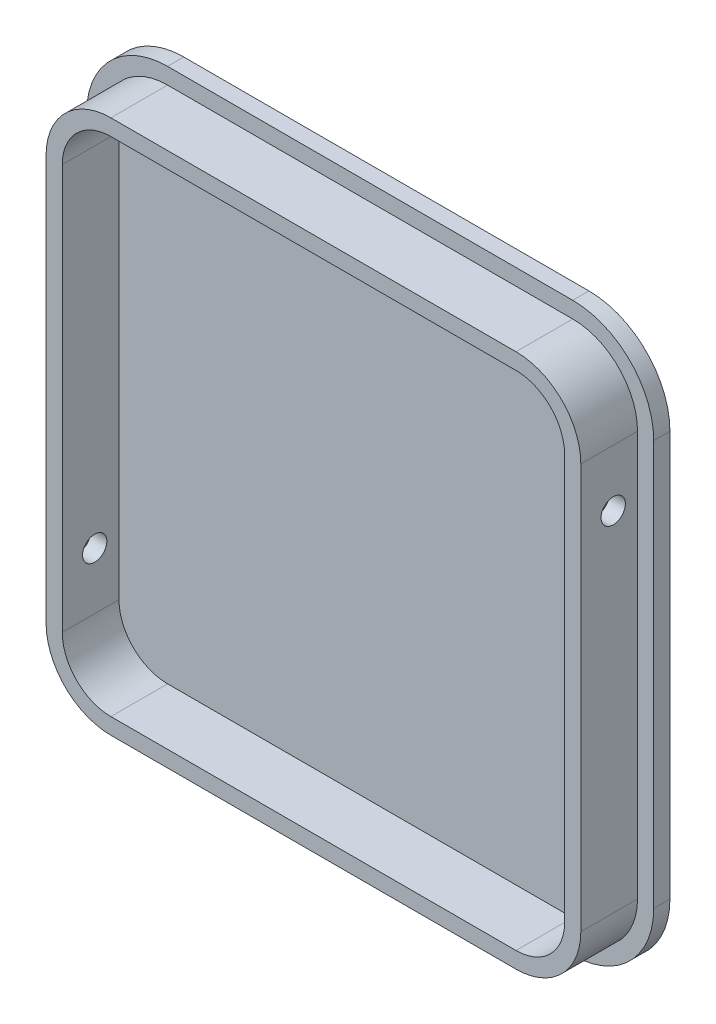
ISO-10303-21;
HEADER;
FILE_DESCRIPTION(('STEP AP214'),'2;1');
FILE_NAME('part.step','',(''),(''),'','','');
FILE_SCHEMA(('AUTOMOTIVE_DESIGN { 1 0 10303 214 1 1 1 1 }'));
ENDSEC;
DATA;
#1=APPLICATION_CONTEXT('core data for automotive mechanical design processes');
#2=APPLICATION_PROTOCOL_DEFINITION('international standard','automotive_design',2000,#1);
#3=PRODUCT_CONTEXT('',#1,'mechanical');
#4=PRODUCT('Part','Part','',(#3));
#5=PRODUCT_RELATED_PRODUCT_CATEGORY('part','',(#4));
#6=PRODUCT_DEFINITION_FORMATION('','',#4);
#7=PRODUCT_DEFINITION_CONTEXT('part definition',#1,'design');
#8=PRODUCT_DEFINITION('design','',#6,#7);
#9=PRODUCT_DEFINITION_SHAPE('','',#8);
#10=(LENGTH_UNIT() NAMED_UNIT(*) SI_UNIT(.MILLI.,.METRE.));
#11=(NAMED_UNIT(*) PLANE_ANGLE_UNIT() SI_UNIT($,.RADIAN.));
#12=(NAMED_UNIT(*) SI_UNIT($,.STERADIAN.) SOLID_ANGLE_UNIT());
#13=UNCERTAINTY_MEASURE_WITH_UNIT(LENGTH_MEASURE(1.E-05),#10,'distance_accuracy_value','');
#14=(GEOMETRIC_REPRESENTATION_CONTEXT(3) GLOBAL_UNCERTAINTY_ASSIGNED_CONTEXT((#13)) GLOBAL_UNIT_ASSIGNED_CONTEXT((#10,
#11,#12)) REPRESENTATION_CONTEXT('',''));
#15=CARTESIAN_POINT('',(0.,0.,0.));
#16=DIRECTION('',(0.,0.,1.));
#17=DIRECTION('',(1.,0.,0.));
#18=AXIS2_PLACEMENT_3D('',#15,#16,#17);
#19=CARTESIAN_POINT('',(-23.1085058967154,12.9180091675496,9.));
#20=DIRECTION('',(0.,0.,-1.));
#21=DIRECTION('',(-1.,0.,0.));
#22=AXIS2_PLACEMENT_3D('',#19,#20,#21);
#23=PLANE('',#22);
#24=CARTESIAN_POINT('',(-23.1085058967154,12.9180091675496,9.));
#25=DIRECTION('',(0.,0.,1.));
#26=DIRECTION('',(-1.,0.,0.));
#27=AXIS2_PLACEMENT_3D('',#24,#25,#26);
#28=CIRCLE('',#27,8.);
#29=CARTESIAN_POINT('',(-23.1085058967153,20.9180091675496,9.));
#30=VERTEX_POINT('',#29);
#31=CARTESIAN_POINT('',(-31.1085058967154,12.9180091675496,9.));
#32=VERTEX_POINT('',#31);
#33=EDGE_CURVE('E280',#30,#32,#28,.T.);
#34=ORIENTED_EDGE('',*,*,#33,.T.);
#35=DIRECTION('',(0.,-1.,0.));
#36=VECTOR('',#35,1.);
#37=CARTESIAN_POINT('',(-31.1085058967154,12.9180091675496,9.));
#38=LINE('',#37,#36);
#39=CARTESIAN_POINT('',(-31.1085058967154,-37.0819908324503,9.));
#40=VERTEX_POINT('',#39);
#41=EDGE_CURVE('E284',#32,#40,#38,.T.);
#42=ORIENTED_EDGE('',*,*,#41,.T.);
#43=CARTESIAN_POINT('',(-23.1085058967154,-37.0819908324504,9.));
#44=DIRECTION('',(0.,0.,1.));
#45=DIRECTION('',(-1.,0.,0.));
#46=AXIS2_PLACEMENT_3D('',#43,#44,#45);
#47=CIRCLE('',#46,8.);
#48=CARTESIAN_POINT('',(-23.1085058967153,-45.0819908324504,9.));
#49=VERTEX_POINT('',#48);
#50=EDGE_CURVE('E288',#40,#49,#47,.T.);
#51=ORIENTED_EDGE('',*,*,#50,.T.);
#52=DIRECTION('',(1.,0.,0.));
#53=VECTOR('',#52,1.);
#54=CARTESIAN_POINT('',(-23.1085058967153,-45.0819908324504,9.));
#55=LINE('',#54,#53);
#56=CARTESIAN_POINT('',(26.8914941032846,-45.0819908324504,9.));
#57=VERTEX_POINT('',#56);
#58=EDGE_CURVE('E291',#49,#57,#55,.T.);
#59=ORIENTED_EDGE('',*,*,#58,.T.);
#60=CARTESIAN_POINT('',(26.8914941032847,-37.0819908324504,9.));
#61=DIRECTION('',(0.,0.,1.));
#62=DIRECTION('',(1.,0.,0.));
#63=AXIS2_PLACEMENT_3D('',#60,#61,#62);
#64=CIRCLE('',#63,8.);
#65=CARTESIAN_POINT('',(34.8914941032847,-37.0819908324504,9.));
#66=VERTEX_POINT('',#65);
#67=EDGE_CURVE('E294',#57,#66,#64,.T.);
#68=ORIENTED_EDGE('',*,*,#67,.T.);
#69=DIRECTION('',(0.,1.,0.));
#70=VECTOR('',#69,1.);
#71=CARTESIAN_POINT('',(34.8914941032846,12.9180091675496,9.));
#72=LINE('',#71,#70);
#73=CARTESIAN_POINT('',(34.8914941032846,12.9180091675496,9.));
#74=VERTEX_POINT('',#73);
#75=EDGE_CURVE('E297',#66,#74,#72,.T.);
#76=ORIENTED_EDGE('',*,*,#75,.T.);
#77=CARTESIAN_POINT('',(26.8914941032846,12.9180091675496,9.));
#78=DIRECTION('',(0.,0.,1.));
#79=DIRECTION('',(1.,0.,0.));
#80=AXIS2_PLACEMENT_3D('',#77,#78,#79);
#81=CIRCLE('',#80,8.);
#82=CARTESIAN_POINT('',(26.8914941032846,20.9180091675496,9.));
#83=VERTEX_POINT('',#82);
#84=EDGE_CURVE('E300',#74,#83,#81,.T.);
#85=ORIENTED_EDGE('',*,*,#84,.T.);
#86=DIRECTION('',(-1.,0.,0.));
#87=VECTOR('',#86,1.);
#88=CARTESIAN_POINT('',(-23.1085058967153,20.9180091675496,9.));
#89=LINE('',#88,#87);
#90=EDGE_CURVE('E303',#83,#30,#89,.T.);
#91=ORIENTED_EDGE('',*,*,#90,.T.);
#92=EDGE_LOOP('',(#34,#42,#51,#59,#68,#76,#85,#91));
#93=FACE_BOUND('',#92,.T.);
#94=CARTESIAN_POINT('',(-23.1085058967154,12.9180091675496,9.));
#95=DIRECTION('',(0.,0.,-1.));
#96=DIRECTION('',(-1.,0.,0.));
#97=AXIS2_PLACEMENT_3D('',#94,#95,#96);
#98=CIRCLE('',#97,6.);
#99=CARTESIAN_POINT('',(-23.1085058967153,18.9180091675496,9.));
#100=VERTEX_POINT('',#99);
#101=CARTESIAN_POINT('',(-29.1085058967154,12.9180091675496,9.));
#102=VERTEX_POINT('',#101);
#103=EDGE_CURVE('E204',#100,#102,#98,.F.);
#104=ORIENTED_EDGE('',*,*,#103,.F.);
#105=DIRECTION('',(-1.,0.,0.));
#106=VECTOR('',#105,1.);
#107=CARTESIAN_POINT('',(-23.1085058967154,18.9180091675496,9.));
#108=LINE('',#107,#106);
#109=CARTESIAN_POINT('',(26.8914941032846,18.9180091675496,9.));
#110=VERTEX_POINT('',#109);
#111=EDGE_CURVE('E250',#110,#100,#108,.T.);
#112=ORIENTED_EDGE('',*,*,#111,.F.);
#113=CARTESIAN_POINT('',(26.8914941032846,12.9180091675496,9.));
#114=DIRECTION('',(0.,0.,-1.));
#115=DIRECTION('',(-1.,0.,0.));
#116=AXIS2_PLACEMENT_3D('',#113,#114,#115);
#117=CIRCLE('',#116,6.);
#118=CARTESIAN_POINT('',(32.8914941032846,12.9180091675496,9.));
#119=VERTEX_POINT('',#118);
#120=EDGE_CURVE('E247',#119,#110,#117,.F.);
#121=ORIENTED_EDGE('',*,*,#120,.F.);
#122=DIRECTION('',(0.,1.,0.));
#123=VECTOR('',#122,1.);
#124=CARTESIAN_POINT('',(32.8914941032846,12.9180091675497,9.));
#125=LINE('',#124,#123);
#126=CARTESIAN_POINT('',(32.8914941032847,-37.0819908324504,9.));
#127=VERTEX_POINT('',#126);
#128=EDGE_CURVE('E244',#127,#119,#125,.T.);
#129=ORIENTED_EDGE('',*,*,#128,.F.);
#130=CARTESIAN_POINT('',(26.8914941032847,-37.0819908324504,9.));
#131=DIRECTION('',(0.,0.,-1.));
#132=DIRECTION('',(-1.,0.,0.));
#133=AXIS2_PLACEMENT_3D('',#130,#131,#132);
#134=CIRCLE('',#133,6.);
#135=CARTESIAN_POINT('',(26.8914941032846,-43.0819908324504,9.));
#136=VERTEX_POINT('',#135);
#137=EDGE_CURVE('E241',#136,#127,#134,.F.);
#138=ORIENTED_EDGE('',*,*,#137,.F.);
#139=DIRECTION('',(1.,0.,0.));
#140=VECTOR('',#139,1.);
#141=CARTESIAN_POINT('',(-23.1085058967154,-43.0819908324504,9.));
#142=LINE('',#141,#140);
#143=CARTESIAN_POINT('',(-23.1085058967153,-43.0819908324504,9.));
#144=VERTEX_POINT('',#143);
#145=EDGE_CURVE('E235',#144,#136,#142,.T.);
#146=ORIENTED_EDGE('',*,*,#145,.F.);
#147=CARTESIAN_POINT('',(-23.1085058967154,-37.0819908324504,9.));
#148=DIRECTION('',(0.,0.,-1.));
#149=DIRECTION('',(-1.,0.,0.));
#150=AXIS2_PLACEMENT_3D('',#147,#148,#149);
#151=CIRCLE('',#150,6.);
#152=CARTESIAN_POINT('',(-29.1085058967153,-37.0819908324503,9.));
#153=VERTEX_POINT('',#152);
#154=EDGE_CURVE('E231',#153,#144,#151,.F.);
#155=ORIENTED_EDGE('',*,*,#154,.F.);
#156=DIRECTION('',(0.,-1.,0.));
#157=VECTOR('',#156,1.);
#158=CARTESIAN_POINT('',(-29.1085058967154,12.9180091675496,9.));
#159=LINE('',#158,#157);
#160=EDGE_CURVE('E215',#102,#153,#159,.T.);
#161=ORIENTED_EDGE('',*,*,#160,.F.);
#162=EDGE_LOOP('',(#104,#112,#121,#129,#138,#146,#155,#161));
#163=FACE_BOUND('',#162,.T.);
#164=ADVANCED_FACE('F39',(#93,#163),#23,.F.);
#165=CARTESIAN_POINT('',(-23.1085058967154,12.9180091675496,2.));
#166=DIRECTION('',(0.,0.,-1.));
#167=DIRECTION('',(-1.,0.,0.));
#168=AXIS2_PLACEMENT_3D('',#165,#166,#167);
#169=PLANE('',#168);
#170=CARTESIAN_POINT('',(-23.1085058967154,12.9180091675496,2.));
#171=DIRECTION('',(0.,0.,1.));
#172=DIRECTION('',(-1.,0.,0.));
#173=AXIS2_PLACEMENT_3D('',#170,#171,#172);
#174=CIRCLE('',#173,10.);
#175=CARTESIAN_POINT('',(-23.1085058967154,22.9180091675496,2.));
#176=VERTEX_POINT('',#175);
#177=CARTESIAN_POINT('',(-33.1085058967154,12.9180091675496,2.));
#178=VERTEX_POINT('',#177);
#179=EDGE_CURVE('E367',#176,#178,#174,.T.);
#180=ORIENTED_EDGE('',*,*,#179,.T.);
#181=DIRECTION('',(0.,-1.,0.));
#182=VECTOR('',#181,1.);
#183=CARTESIAN_POINT('',(-33.1085058967154,12.9180091675496,2.));
#184=LINE('',#183,#182);
#185=CARTESIAN_POINT('',(-33.1085058967154,-37.0819908324504,2.));
#186=VERTEX_POINT('',#185);
#187=EDGE_CURVE('E371',#178,#186,#184,.T.);
#188=ORIENTED_EDGE('',*,*,#187,.T.);
#189=CARTESIAN_POINT('',(-23.1085058967154,-37.0819908324504,2.));
#190=DIRECTION('',(0.,0.,1.));
#191=DIRECTION('',(-1.,0.,0.));
#192=AXIS2_PLACEMENT_3D('',#189,#190,#191);
#193=CIRCLE('',#192,10.);
#194=CARTESIAN_POINT('',(-23.1085058967153,-47.0819908324504,2.));
#195=VERTEX_POINT('',#194);
#196=EDGE_CURVE('E375',#186,#195,#193,.T.);
#197=ORIENTED_EDGE('',*,*,#196,.T.);
#198=DIRECTION('',(1.,0.,0.));
#199=VECTOR('',#198,1.);
#200=CARTESIAN_POINT('',(-23.1085058967154,-47.0819908324504,2.));
#201=LINE('',#200,#199);
#202=CARTESIAN_POINT('',(26.8914941032846,-47.0819908324504,2.));
#203=VERTEX_POINT('',#202);
#204=EDGE_CURVE('E378',#195,#203,#201,.T.);
#205=ORIENTED_EDGE('',*,*,#204,.T.);
#206=CARTESIAN_POINT('',(26.8914941032846,-37.0819908324504,2.));
#207=DIRECTION('',(0.,0.,1.));
#208=DIRECTION('',(1.,0.,0.));
#209=AXIS2_PLACEMENT_3D('',#206,#207,#208);
#210=CIRCLE('',#209,10.);
#211=CARTESIAN_POINT('',(36.8914941032847,-37.0819908324504,2.));
#212=VERTEX_POINT('',#211);
#213=EDGE_CURVE('E381',#203,#212,#210,.T.);
#214=ORIENTED_EDGE('',*,*,#213,.T.);
#215=DIRECTION('',(0.,1.,0.));
#216=VECTOR('',#215,1.);
#217=CARTESIAN_POINT('',(36.8914941032847,12.9180091675496,2.));
#218=LINE('',#217,#216);
#219=CARTESIAN_POINT('',(36.8914941032847,12.9180091675496,2.));
#220=VERTEX_POINT('',#219);
#221=EDGE_CURVE('E384',#212,#220,#218,.T.);
#222=ORIENTED_EDGE('',*,*,#221,.T.);
#223=CARTESIAN_POINT('',(26.8914941032847,12.9180091675496,2.));
#224=DIRECTION('',(0.,0.,1.));
#225=DIRECTION('',(1.,0.,0.));
#226=AXIS2_PLACEMENT_3D('',#223,#224,#225);
#227=CIRCLE('',#226,10.);
#228=CARTESIAN_POINT('',(26.8914941032847,22.9180091675496,2.));
#229=VERTEX_POINT('',#228);
#230=EDGE_CURVE('E387',#220,#229,#227,.T.);
#231=ORIENTED_EDGE('',*,*,#230,.T.);
#232=DIRECTION('',(-1.,0.,0.));
#233=VECTOR('',#232,1.);
#234=CARTESIAN_POINT('',(-23.1085058967154,22.9180091675496,2.));
#235=LINE('',#234,#233);
#236=EDGE_CURVE('E390',#229,#176,#235,.T.);
#237=ORIENTED_EDGE('',*,*,#236,.T.);
#238=EDGE_LOOP('',(#180,#188,#197,#205,#214,#222,#231,#237));
#239=FACE_BOUND('',#238,.T.);
#240=CARTESIAN_POINT('',(-23.1085058967154,12.9180091675496,2.));
#241=DIRECTION('',(0.,0.,1.));
#242=DIRECTION('',(-1.,0.,0.));
#243=AXIS2_PLACEMENT_3D('',#240,#241,#242);
#244=CIRCLE('',#243,8.);
#245=CARTESIAN_POINT('',(-23.1085058967153,20.9180091675496,2.));
#246=VERTEX_POINT('',#245);
#247=CARTESIAN_POINT('',(-31.1085058967154,12.9180091675496,2.));
#248=VERTEX_POINT('',#247);
#249=EDGE_CURVE('E65',#246,#248,#244,.T.);
#250=ORIENTED_EDGE('',*,*,#249,.F.);
#251=DIRECTION('',(-1.,0.,0.));
#252=VECTOR('',#251,1.);
#253=CARTESIAN_POINT('',(-23.1085058967153,20.9180091675496,2.));
#254=LINE('',#253,#252);
#255=CARTESIAN_POINT('',(26.8914941032846,20.9180091675496,2.));
#256=VERTEX_POINT('',#255);
#257=EDGE_CURVE('E285',#256,#246,#254,.T.);
#258=ORIENTED_EDGE('',*,*,#257,.F.);
#259=CARTESIAN_POINT('',(26.8914941032846,12.9180091675496,2.));
#260=DIRECTION('',(0.,0.,1.));
#261=DIRECTION('',(1.,0.,0.));
#262=AXIS2_PLACEMENT_3D('',#259,#260,#261);
#263=CIRCLE('',#262,8.);
#264=CARTESIAN_POINT('',(34.8914941032846,12.9180091675496,2.));
#265=VERTEX_POINT('',#264);
#266=EDGE_CURVE('E329',#265,#256,#263,.T.);
#267=ORIENTED_EDGE('',*,*,#266,.F.);
#268=DIRECTION('',(0.,1.,0.));
#269=VECTOR('',#268,1.);
#270=CARTESIAN_POINT('',(34.8914941032846,12.9180091675496,2.));
#271=LINE('',#270,#269);
#272=CARTESIAN_POINT('',(34.8914941032847,-37.0819908324504,2.));
#273=VERTEX_POINT('',#272);
#274=EDGE_CURVE('E325',#273,#265,#271,.T.);
#275=ORIENTED_EDGE('',*,*,#274,.F.);
#276=CARTESIAN_POINT('',(26.8914941032847,-37.0819908324504,2.));
#277=DIRECTION('',(0.,0.,1.));
#278=DIRECTION('',(1.,0.,0.));
#279=AXIS2_PLACEMENT_3D('',#276,#277,#278);
#280=CIRCLE('',#279,8.);
#281=CARTESIAN_POINT('',(26.8914941032846,-45.0819908324504,2.));
#282=VERTEX_POINT('',#281);
#283=EDGE_CURVE('E321',#282,#273,#280,.T.);
#284=ORIENTED_EDGE('',*,*,#283,.F.);
#285=DIRECTION('',(1.,0.,0.));
#286=VECTOR('',#285,1.);
#287=CARTESIAN_POINT('',(-23.1085058967153,-45.0819908324504,2.));
#288=LINE('',#287,#286);
#289=CARTESIAN_POINT('',(-23.1085058967153,-45.0819908324504,2.));
#290=VERTEX_POINT('',#289);
#291=EDGE_CURVE('E317',#290,#282,#288,.T.);
#292=ORIENTED_EDGE('',*,*,#291,.F.);
#293=CARTESIAN_POINT('',(-23.1085058967154,-37.0819908324504,2.));
#294=DIRECTION('',(0.,0.,1.));
#295=DIRECTION('',(-1.,0.,0.));
#296=AXIS2_PLACEMENT_3D('',#293,#294,#295);
#297=CIRCLE('',#296,8.);
#298=CARTESIAN_POINT('',(-31.1085058967154,-37.0819908324503,2.));
#299=VERTEX_POINT('',#298);
#300=EDGE_CURVE('E313',#299,#290,#297,.T.);
#301=ORIENTED_EDGE('',*,*,#300,.F.);
#302=DIRECTION('',(0.,-1.,0.));
#303=VECTOR('',#302,1.);
#304=CARTESIAN_POINT('',(-31.1085058967154,12.9180091675496,2.));
#305=LINE('',#304,#303);
#306=EDGE_CURVE('E309',#248,#299,#305,.T.);
#307=ORIENTED_EDGE('',*,*,#306,.F.);
#308=EDGE_LOOP('',(#250,#258,#267,#275,#284,#292,#301,#307));
#309=FACE_BOUND('',#308,.T.);
#310=ADVANCED_FACE('F508',(#239,#309),#169,.F.);
#311=CARTESIAN_POINT('',(-23.1085058967154,12.9180091675496,2.));
#312=DIRECTION('',(0.,0.,-1.));
#313=DIRECTION('',(-1.,0.,0.));
#314=AXIS2_PLACEMENT_3D('',#311,#312,#313);
#315=CYLINDRICAL_SURFACE('',#314,10.);
#316=CARTESIAN_POINT('',(-23.1085058967154,12.9180091675496,0.));
#317=DIRECTION('',(0.,0.,1.));
#318=DIRECTION('',(-1.,0.,0.));
#319=AXIS2_PLACEMENT_3D('',#316,#317,#318);
#320=CIRCLE('',#319,10.);
#321=CARTESIAN_POINT('',(-23.1085058967154,22.9180091675496,0.));
#322=VERTEX_POINT('',#321);
#323=CARTESIAN_POINT('',(-33.1085058967154,12.9180091675496,0.));
#324=VERTEX_POINT('',#323);
#325=EDGE_CURVE('E366',#322,#324,#320,.T.);
#326=ORIENTED_EDGE('',*,*,#325,.T.);
#327=DIRECTION('',(0.,0.,-1.));
#328=VECTOR('',#327,1.);
#329=CARTESIAN_POINT('',(-33.1085058967154,12.9180091675496,2.));
#330=LINE('',#329,#328);
#331=EDGE_CURVE('E11',#178,#324,#330,.T.);
#332=ORIENTED_EDGE('',*,*,#331,.F.);
#333=ORIENTED_EDGE('',*,*,#179,.F.);
#334=DIRECTION('',(0.,0.,-1.));
#335=VECTOR('',#334,1.);
#336=CARTESIAN_POINT('',(-23.1085058967154,22.9180091675496,2.));
#337=LINE('',#336,#335);
#338=EDGE_CURVE('E393',#176,#322,#337,.T.);
#339=ORIENTED_EDGE('',*,*,#338,.T.);
#340=EDGE_LOOP('',(#326,#332,#333,#339));
#341=FACE_BOUND('',#340,.T.);
#342=ADVANCED_FACE('F41',(#341),#315,.T.);
#343=CARTESIAN_POINT('',(-33.1085058967154,12.9180091675496,2.));
#344=DIRECTION('',(1.,0.,0.));
#345=DIRECTION('',(0.,0.,-1.));
#346=AXIS2_PLACEMENT_3D('',#343,#344,#345);
#347=PLANE('',#346);
#348=DIRECTION('',(0.,-1.,0.));
#349=VECTOR('',#348,1.);
#350=CARTESIAN_POINT('',(-33.1085058967154,12.9180091675496,0.));
#351=LINE('',#350,#349);
#352=CARTESIAN_POINT('',(-33.1085058967154,-37.0819908324504,0.));
#353=VERTEX_POINT('',#352);
#354=EDGE_CURVE('E397',#324,#353,#351,.T.);
#355=ORIENTED_EDGE('',*,*,#354,.T.);
#356=DIRECTION('',(0.,0.,-1.));
#357=VECTOR('',#356,1.);
#358=CARTESIAN_POINT('',(-33.1085058967154,-37.0819908324504,2.));
#359=LINE('',#358,#357);
#360=EDGE_CURVE('E49',#186,#353,#359,.T.);
#361=ORIENTED_EDGE('',*,*,#360,.F.);
#362=ORIENTED_EDGE('',*,*,#187,.F.);
#363=ORIENTED_EDGE('',*,*,#331,.T.);
#364=EDGE_LOOP('',(#355,#361,#362,#363));
#365=FACE_BOUND('',#364,.T.);
#366=ADVANCED_FACE('F576',(#365),#347,.F.);
#367=CARTESIAN_POINT('',(-23.1085058967154,-37.0819908324504,2.));
#368=DIRECTION('',(0.,0.,-1.));
#369=DIRECTION('',(-1.,0.,0.));
#370=AXIS2_PLACEMENT_3D('',#367,#368,#369);
#371=CYLINDRICAL_SURFACE('',#370,10.);
#372=CARTESIAN_POINT('',(-23.1085058967154,-37.0819908324504,0.));
#373=DIRECTION('',(0.,0.,1.));
#374=DIRECTION('',(-1.,0.,0.));
#375=AXIS2_PLACEMENT_3D('',#372,#373,#374);
#376=CIRCLE('',#375,10.);
#377=CARTESIAN_POINT('',(-23.1085058967153,-47.0819908324504,0.));
#378=VERTEX_POINT('',#377);
#379=EDGE_CURVE('E400',#353,#378,#376,.T.);
#380=ORIENTED_EDGE('',*,*,#379,.T.);
#381=DIRECTION('',(0.,0.,-1.));
#382=VECTOR('',#381,1.);
#383=CARTESIAN_POINT('',(-23.1085058967153,-47.0819908324504,2.));
#384=LINE('',#383,#382);
#385=EDGE_CURVE('E436',#195,#378,#384,.T.);
#386=ORIENTED_EDGE('',*,*,#385,.F.);
#387=ORIENTED_EDGE('',*,*,#196,.F.);
#388=ORIENTED_EDGE('',*,*,#360,.T.);
#389=EDGE_LOOP('',(#380,#386,#387,#388));
#390=FACE_BOUND('',#389,.T.);
#391=ADVANCED_FACE('F573',(#390),#371,.T.);
#392=CARTESIAN_POINT('',(-23.1085058967154,-47.0819908324504,2.));
#393=DIRECTION('',(0.,1.,0.));
#394=DIRECTION('',(0.,0.,1.));
#395=AXIS2_PLACEMENT_3D('',#392,#393,#394);
#396=PLANE('',#395);
#397=DIRECTION('',(1.,0.,0.));
#398=VECTOR('',#397,1.);
#399=CARTESIAN_POINT('',(-23.1085058967154,-47.0819908324504,0.));
#400=LINE('',#399,#398);
#401=CARTESIAN_POINT('',(26.8914941032846,-47.0819908324504,0.));
#402=VERTEX_POINT('',#401);
#403=EDGE_CURVE('E403',#378,#402,#400,.T.);
#404=ORIENTED_EDGE('',*,*,#403,.T.);
#405=DIRECTION('',(0.,0.,-1.));
#406=VECTOR('',#405,1.);
#407=CARTESIAN_POINT('',(26.8914941032846,-47.0819908324504,2.));
#408=LINE('',#407,#406);
#409=EDGE_CURVE('E432',#203,#402,#408,.T.);
#410=ORIENTED_EDGE('',*,*,#409,.F.);
#411=ORIENTED_EDGE('',*,*,#204,.F.);
#412=ORIENTED_EDGE('',*,*,#385,.T.);
#413=EDGE_LOOP('',(#404,#410,#411,#412));
#414=FACE_BOUND('',#413,.T.);
#415=ADVANCED_FACE('F569',(#414),#396,.F.);
#416=CARTESIAN_POINT('',(26.8914941032846,-37.0819908324504,2.));
#417=DIRECTION('',(0.,0.,-1.));
#418=DIRECTION('',(-1.,0.,0.));
#419=AXIS2_PLACEMENT_3D('',#416,#417,#418);
#420=CYLINDRICAL_SURFACE('',#419,10.);
#421=CARTESIAN_POINT('',(26.8914941032846,-37.0819908324504,0.));
#422=DIRECTION('',(0.,0.,1.));
#423=DIRECTION('',(1.,0.,0.));
#424=AXIS2_PLACEMENT_3D('',#421,#422,#423);
#425=CIRCLE('',#424,10.);
#426=CARTESIAN_POINT('',(36.8914941032847,-37.0819908324504,0.));
#427=VERTEX_POINT('',#426);
#428=EDGE_CURVE('E406',#402,#427,#425,.T.);
#429=ORIENTED_EDGE('',*,*,#428,.T.);
#430=DIRECTION('',(0.,0.,-1.));
#431=VECTOR('',#430,1.);
#432=CARTESIAN_POINT('',(36.8914941032847,-37.0819908324504,2.));
#433=LINE('',#432,#431);
#434=EDGE_CURVE('E428',#212,#427,#433,.T.);
#435=ORIENTED_EDGE('',*,*,#434,.F.);
#436=ORIENTED_EDGE('',*,*,#213,.F.);
#437=ORIENTED_EDGE('',*,*,#409,.T.);
#438=EDGE_LOOP('',(#429,#435,#436,#437));
#439=FACE_BOUND('',#438,.T.);
#440=ADVANCED_FACE('F565',(#439),#420,.T.);
#441=CARTESIAN_POINT('',(36.8914941032847,12.9180091675496,2.));
#442=DIRECTION('',(-1.,0.,0.));
#443=DIRECTION('',(0.,0.,1.));
#444=AXIS2_PLACEMENT_3D('',#441,#442,#443);
#445=PLANE('',#444);
#446=DIRECTION('',(0.,1.,0.));
#447=VECTOR('',#446,1.);
#448=CARTESIAN_POINT('',(36.8914941032847,12.9180091675496,0.));
#449=LINE('',#448,#447);
#450=CARTESIAN_POINT('',(36.8914941032847,12.9180091675496,0.));
#451=VERTEX_POINT('',#450);
#452=EDGE_CURVE('E409',#427,#451,#449,.T.);
#453=ORIENTED_EDGE('',*,*,#452,.T.);
#454=DIRECTION('',(0.,0.,-1.));
#455=VECTOR('',#454,1.);
#456=CARTESIAN_POINT('',(36.8914941032847,12.9180091675496,2.));
#457=LINE('',#456,#455);
#458=EDGE_CURVE('E424',#220,#451,#457,.T.);
#459=ORIENTED_EDGE('',*,*,#458,.F.);
#460=ORIENTED_EDGE('',*,*,#221,.F.);
#461=ORIENTED_EDGE('',*,*,#434,.T.);
#462=EDGE_LOOP('',(#453,#459,#460,#461));
#463=FACE_BOUND('',#462,.T.);
#464=ADVANCED_FACE('F561',(#463),#445,.F.);
#465=CARTESIAN_POINT('',(26.8914941032847,12.9180091675496,2.));
#466=DIRECTION('',(0.,0.,-1.));
#467=DIRECTION('',(-1.,0.,0.));
#468=AXIS2_PLACEMENT_3D('',#465,#466,#467);
#469=CYLINDRICAL_SURFACE('',#468,10.);
#470=CARTESIAN_POINT('',(26.8914941032847,12.9180091675496,0.));
#471=DIRECTION('',(0.,0.,1.));
#472=DIRECTION('',(1.,0.,0.));
#473=AXIS2_PLACEMENT_3D('',#470,#471,#472);
#474=CIRCLE('',#473,10.);
#475=CARTESIAN_POINT('',(26.8914941032847,22.9180091675496,0.));
#476=VERTEX_POINT('',#475);
#477=EDGE_CURVE('E412',#451,#476,#474,.T.);
#478=ORIENTED_EDGE('',*,*,#477,.T.);
#479=DIRECTION('',(0.,0.,-1.));
#480=VECTOR('',#479,1.);
#481=CARTESIAN_POINT('',(26.8914941032847,22.9180091675496,2.));
#482=LINE('',#481,#480);
#483=EDGE_CURVE('E420',#229,#476,#482,.T.);
#484=ORIENTED_EDGE('',*,*,#483,.F.);
#485=ORIENTED_EDGE('',*,*,#230,.F.);
#486=ORIENTED_EDGE('',*,*,#458,.T.);
#487=EDGE_LOOP('',(#478,#484,#485,#486));
#488=FACE_BOUND('',#487,.T.);
#489=ADVANCED_FACE('F557',(#488),#469,.T.);
#490=CARTESIAN_POINT('',(-23.1085058967154,22.9180091675496,2.));
#491=DIRECTION('',(0.,-1.,0.));
#492=DIRECTION('',(0.,0.,-1.));
#493=AXIS2_PLACEMENT_3D('',#490,#491,#492);
#494=PLANE('',#493);
#495=DIRECTION('',(-1.,0.,0.));
#496=VECTOR('',#495,1.);
#497=CARTESIAN_POINT('',(-23.1085058967154,22.9180091675496,0.));
#498=LINE('',#497,#496);
#499=EDGE_CURVE('E372',#476,#322,#498,.T.);
#500=ORIENTED_EDGE('',*,*,#499,.T.);
#501=ORIENTED_EDGE('',*,*,#338,.F.);
#502=ORIENTED_EDGE('',*,*,#236,.F.);
#503=ORIENTED_EDGE('',*,*,#483,.T.);
#504=EDGE_LOOP('',(#500,#501,#502,#503));
#505=FACE_BOUND('',#504,.T.);
#506=ADVANCED_FACE('F553',(#505),#494,.F.);
#507=CARTESIAN_POINT('',(-23.1085058967154,12.9180091675496,0.));
#508=DIRECTION('',(0.,0.,-1.));
#509=DIRECTION('',(-1.,0.,0.));
#510=AXIS2_PLACEMENT_3D('',#507,#508,#509);
#511=PLANE('',#510);
#512=ORIENTED_EDGE('',*,*,#325,.F.);
#513=ORIENTED_EDGE('',*,*,#499,.F.);
#514=ORIENTED_EDGE('',*,*,#477,.F.);
#515=ORIENTED_EDGE('',*,*,#452,.F.);
#516=ORIENTED_EDGE('',*,*,#428,.F.);
#517=ORIENTED_EDGE('',*,*,#403,.F.);
#518=ORIENTED_EDGE('',*,*,#379,.F.);
#519=ORIENTED_EDGE('',*,*,#354,.F.);
#520=EDGE_LOOP('',(#512,#513,#514,#515,#516,#517,#518,#519));
#521=FACE_BOUND('',#520,.T.);
#522=ADVANCED_FACE('F548',(#521),#511,.T.);
#523=CARTESIAN_POINT('',(-23.1085058967154,12.9180091675496,9.));
#524=DIRECTION('',(0.,0.,-1.));
#525=DIRECTION('',(-1.,0.,0.));
#526=AXIS2_PLACEMENT_3D('',#523,#524,#525);
#527=CYLINDRICAL_SURFACE('',#526,8.);
#528=ORIENTED_EDGE('',*,*,#249,.T.);
#529=DIRECTION('',(0.,0.,-1.));
#530=VECTOR('',#529,1.);
#531=CARTESIAN_POINT('',(-31.1085058967154,12.9180091675496,9.));
#532=LINE('',#531,#530);
#533=EDGE_CURVE('E362',#32,#248,#532,.T.);
#534=ORIENTED_EDGE('',*,*,#533,.F.);
#535=ORIENTED_EDGE('',*,*,#33,.F.);
#536=DIRECTION('',(0.,0.,-1.));
#537=VECTOR('',#536,1.);
#538=CARTESIAN_POINT('',(-23.1085058967153,20.9180091675496,9.));
#539=LINE('',#538,#537);
#540=EDGE_CURVE('E306',#30,#246,#539,.T.);
#541=ORIENTED_EDGE('',*,*,#540,.T.);
#542=EDGE_LOOP('',(#528,#534,#535,#541));
#543=FACE_BOUND('',#542,.T.);
#544=ADVANCED_FACE('F545',(#543),#527,.T.);
#545=CARTESIAN_POINT('',(-31.1085058967154,12.9180091675496,9.));
#546=DIRECTION('',(1.,0.,0.));
#547=DIRECTION('',(0.,1.,0.));
#548=AXIS2_PLACEMENT_3D('',#545,#546,#547);
#549=PLANE('',#548);
#550=CARTESIAN_POINT('',(-31.1085058967154,-30.0819908324503,5.));
#551=DIRECTION('',(-1.,0.,0.));
#552=DIRECTION('',(0.,-1.,0.));
#553=AXIS2_PLACEMENT_3D('',#550,#551,#552);
#554=CIRCLE('',#553,1.5);
#555=CARTESIAN_POINT('',(-31.1085058967154,-31.5819908324503,5.));
#556=VERTEX_POINT('',#555);
#557=EDGE_CURVE('E444',#556,#556,#554,.T.);
#558=ORIENTED_EDGE('',*,*,#557,.F.);
#559=EDGE_LOOP('',(#558));
#560=FACE_BOUND('',#559,.T.);
#561=ORIENTED_EDGE('',*,*,#306,.T.);
#562=DIRECTION('',(0.,0.,-1.));
#563=VECTOR('',#562,1.);
#564=CARTESIAN_POINT('',(-31.1085058967154,-37.0819908324503,9.));
#565=LINE('',#564,#563);
#566=EDGE_CURVE('E358',#40,#299,#565,.T.);
#567=ORIENTED_EDGE('',*,*,#566,.F.);
#568=ORIENTED_EDGE('',*,*,#41,.F.);
#569=ORIENTED_EDGE('',*,*,#533,.T.);
#570=EDGE_LOOP('',(#561,#567,#568,#569));
#571=FACE_BOUND('',#570,.T.);
#572=ADVANCED_FACE('F541',(#560,#571),#549,.F.);
#573=CARTESIAN_POINT('',(-23.1085058967154,-37.0819908324504,9.));
#574=DIRECTION('',(0.,0.,-1.));
#575=DIRECTION('',(-1.,0.,0.));
#576=AXIS2_PLACEMENT_3D('',#573,#574,#575);
#577=CYLINDRICAL_SURFACE('',#576,8.);
#578=ORIENTED_EDGE('',*,*,#300,.T.);
#579=DIRECTION('',(0.,0.,-1.));
#580=VECTOR('',#579,1.);
#581=CARTESIAN_POINT('',(-23.1085058967153,-45.0819908324504,9.));
#582=LINE('',#581,#580);
#583=EDGE_CURVE('E354',#49,#290,#582,.T.);
#584=ORIENTED_EDGE('',*,*,#583,.F.);
#585=ORIENTED_EDGE('',*,*,#50,.F.);
#586=ORIENTED_EDGE('',*,*,#566,.T.);
#587=EDGE_LOOP('',(#578,#584,#585,#586));
#588=FACE_BOUND('',#587,.T.);
#589=ADVANCED_FACE('F537',(#588),#577,.T.);
#590=CARTESIAN_POINT('',(-23.1085058967153,-45.0819908324504,9.));
#591=DIRECTION('',(0.,1.,0.));
#592=DIRECTION('',(0.,0.,1.));
#593=AXIS2_PLACEMENT_3D('',#590,#591,#592);
#594=PLANE('',#593);
#595=ORIENTED_EDGE('',*,*,#291,.T.);
#596=DIRECTION('',(0.,0.,-1.));
#597=VECTOR('',#596,1.);
#598=CARTESIAN_POINT('',(26.8914941032846,-45.0819908324504,9.));
#599=LINE('',#598,#597);
#600=EDGE_CURVE('E350',#57,#282,#599,.T.);
#601=ORIENTED_EDGE('',*,*,#600,.F.);
#602=ORIENTED_EDGE('',*,*,#58,.F.);
#603=ORIENTED_EDGE('',*,*,#583,.T.);
#604=EDGE_LOOP('',(#595,#601,#602,#603));
#605=FACE_BOUND('',#604,.T.);
#606=ADVANCED_FACE('F533',(#605),#594,.F.);
#607=CARTESIAN_POINT('',(26.8914941032847,-37.0819908324504,9.));
#608=DIRECTION('',(0.,0.,-1.));
#609=DIRECTION('',(-1.,0.,0.));
#610=AXIS2_PLACEMENT_3D('',#607,#608,#609);
#611=CYLINDRICAL_SURFACE('',#610,8.);
#612=ORIENTED_EDGE('',*,*,#283,.T.);
#613=DIRECTION('',(0.,0.,-1.));
#614=VECTOR('',#613,1.);
#615=CARTESIAN_POINT('',(34.8914941032847,-37.0819908324504,9.));
#616=LINE('',#615,#614);
#617=EDGE_CURVE('E346',#66,#273,#616,.T.);
#618=ORIENTED_EDGE('',*,*,#617,.F.);
#619=ORIENTED_EDGE('',*,*,#67,.F.);
#620=ORIENTED_EDGE('',*,*,#600,.T.);
#621=EDGE_LOOP('',(#612,#618,#619,#620));
#622=FACE_BOUND('',#621,.T.);
#623=ADVANCED_FACE('F529',(#622),#611,.T.);
#624=CARTESIAN_POINT('',(34.8914941032846,12.9180091675496,9.));
#625=DIRECTION('',(-1.,0.,0.));
#626=DIRECTION('',(0.,-1.,0.));
#627=AXIS2_PLACEMENT_3D('',#624,#625,#626);
#628=PLANE('',#627);
#629=CARTESIAN_POINT('',(34.8914941032847,5.91800916754957,5.));
#630=DIRECTION('',(1.,0.,0.));
#631=DIRECTION('',(0.,1.,0.));
#632=AXIS2_PLACEMENT_3D('',#629,#630,#631);
#633=CIRCLE('',#632,1.5);
#634=CARTESIAN_POINT('',(34.8914941032847,7.41800916754957,5.));
#635=VERTEX_POINT('',#634);
#636=EDGE_CURVE('E454',#635,#635,#633,.T.);
#637=ORIENTED_EDGE('',*,*,#636,.F.);
#638=EDGE_LOOP('',(#637));
#639=FACE_BOUND('',#638,.T.);
#640=ORIENTED_EDGE('',*,*,#274,.T.);
#641=DIRECTION('',(0.,0.,-1.));
#642=VECTOR('',#641,1.);
#643=CARTESIAN_POINT('',(34.8914941032846,12.9180091675496,9.));
#644=LINE('',#643,#642);
#645=EDGE_CURVE('E342',#74,#265,#644,.T.);
#646=ORIENTED_EDGE('',*,*,#645,.F.);
#647=ORIENTED_EDGE('',*,*,#75,.F.);
#648=ORIENTED_EDGE('',*,*,#617,.T.);
#649=EDGE_LOOP('',(#640,#646,#647,#648));
#650=FACE_BOUND('',#649,.T.);
#651=ADVANCED_FACE('F525',(#639,#650),#628,.F.);
#652=CARTESIAN_POINT('',(26.8914941032846,12.9180091675496,9.));
#653=DIRECTION('',(0.,0.,-1.));
#654=DIRECTION('',(-1.,0.,0.));
#655=AXIS2_PLACEMENT_3D('',#652,#653,#654);
#656=CYLINDRICAL_SURFACE('',#655,8.);
#657=ORIENTED_EDGE('',*,*,#266,.T.);
#658=DIRECTION('',(0.,0.,-1.));
#659=VECTOR('',#658,1.);
#660=CARTESIAN_POINT('',(26.8914941032846,20.9180091675496,9.));
#661=LINE('',#660,#659);
#662=EDGE_CURVE('E338',#83,#256,#661,.T.);
#663=ORIENTED_EDGE('',*,*,#662,.F.);
#664=ORIENTED_EDGE('',*,*,#84,.F.);
#665=ORIENTED_EDGE('',*,*,#645,.T.);
#666=EDGE_LOOP('',(#657,#663,#664,#665));
#667=FACE_BOUND('',#666,.T.);
#668=ADVANCED_FACE('F521',(#667),#656,.T.);
#669=CARTESIAN_POINT('',(-23.1085058967153,20.9180091675496,9.));
#670=DIRECTION('',(0.,-1.,0.));
#671=DIRECTION('',(0.,0.,-1.));
#672=AXIS2_PLACEMENT_3D('',#669,#670,#671);
#673=PLANE('',#672);
#674=ORIENTED_EDGE('',*,*,#257,.T.);
#675=ORIENTED_EDGE('',*,*,#540,.F.);
#676=ORIENTED_EDGE('',*,*,#90,.F.);
#677=ORIENTED_EDGE('',*,*,#662,.T.);
#678=EDGE_LOOP('',(#674,#675,#676,#677));
#679=FACE_BOUND('',#678,.T.);
#680=ADVANCED_FACE('F504',(#679),#673,.F.);
#681=CARTESIAN_POINT('',(-29.1085058967154,12.9180091675496,9.));
#682=DIRECTION('',(1.,0.,0.));
#683=DIRECTION('',(0.,1.,0.));
#684=AXIS2_PLACEMENT_3D('',#681,#682,#683);
#685=PLANE('',#684);
#686=CARTESIAN_POINT('',(-29.1085058967153,-30.0819908324503,5.));
#687=DIRECTION('',(1.,0.,0.));
#688=DIRECTION('',(0.,1.,0.));
#689=AXIS2_PLACEMENT_3D('',#686,#687,#688);
#690=CIRCLE('',#689,1.5);
#691=CARTESIAN_POINT('',(-29.1085058967153,-28.5819908324503,5.));
#692=VERTEX_POINT('',#691);
#693=EDGE_CURVE('E216',#692,#692,#690,.T.);
#694=ORIENTED_EDGE('',*,*,#693,.F.);
#695=EDGE_LOOP('',(#694));
#696=FACE_BOUND('',#695,.T.);
#697=DIRECTION('',(0.,0.,1.));
#698=VECTOR('',#697,1.);
#699=CARTESIAN_POINT('',(-29.1085058967154,12.9180091675496,9.));
#700=LINE('',#699,#698);
#701=CARTESIAN_POINT('',(-29.1085058967154,12.9180091675496,2.));
#702=VERTEX_POINT('',#701);
#703=EDGE_CURVE('E208',#102,#702,#700,.F.);
#704=ORIENTED_EDGE('',*,*,#703,.F.);
#705=ORIENTED_EDGE('',*,*,#160,.T.);
#706=DIRECTION('',(0.,0.,-1.));
#707=VECTOR('',#706,1.);
#708=CARTESIAN_POINT('',(-29.1085058967153,-37.0819908324503,9.));
#709=LINE('',#708,#707);
#710=CARTESIAN_POINT('',(-29.1085058967153,-37.0819908324504,2.));
#711=VERTEX_POINT('',#710);
#712=EDGE_CURVE('E227',#153,#711,#709,.T.);
#713=ORIENTED_EDGE('',*,*,#712,.T.);
#714=DIRECTION('',(0.,-1.,0.));
#715=VECTOR('',#714,1.);
#716=CARTESIAN_POINT('',(-29.1085058967154,12.9180091675496,2.));
#717=LINE('',#716,#715);
#718=EDGE_CURVE('E223',#702,#711,#717,.T.);
#719=ORIENTED_EDGE('',*,*,#718,.F.);
#720=EDGE_LOOP('',(#704,#705,#713,#719));
#721=FACE_BOUND('',#720,.T.);
#722=ADVANCED_FACE('F219',(#696,#721),#685,.T.);
#723=CARTESIAN_POINT('',(-23.1085058967154,-37.0819908324504,9.));
#724=DIRECTION('',(0.,0.,-1.));
#725=DIRECTION('',(-1.,0.,0.));
#726=AXIS2_PLACEMENT_3D('',#723,#724,#725);
#727=CYLINDRICAL_SURFACE('',#726,6.);
#728=ORIENTED_EDGE('',*,*,#712,.F.);
#729=ORIENTED_EDGE('',*,*,#154,.T.);
#730=DIRECTION('',(0.,0.,1.));
#731=VECTOR('',#730,1.);
#732=CARTESIAN_POINT('',(-23.1085058967153,-43.0819908324504,9.));
#733=LINE('',#732,#731);
#734=CARTESIAN_POINT('',(-23.1085058967153,-43.0819908324504,2.));
#735=VERTEX_POINT('',#734);
#736=EDGE_CURVE('E461',#144,#735,#733,.F.);
#737=ORIENTED_EDGE('',*,*,#736,.T.);
#738=CARTESIAN_POINT('',(-23.1085058967154,-37.0819908324504,2.));
#739=DIRECTION('',(0.,0.,-1.));
#740=DIRECTION('',(-1.,0.,0.));
#741=AXIS2_PLACEMENT_3D('',#738,#739,#740);
#742=CIRCLE('',#741,6.);
#743=EDGE_CURVE('E274',#711,#735,#742,.F.);
#744=ORIENTED_EDGE('',*,*,#743,.F.);
#745=EDGE_LOOP('',(#728,#729,#737,#744));
#746=FACE_BOUND('',#745,.T.);
#747=ADVANCED_FACE('F496',(#746),#727,.F.);
#748=CARTESIAN_POINT('',(-23.1085058967153,-43.0819908324504,9.));
#749=DIRECTION('',(0.,1.,0.));
#750=DIRECTION('',(0.,0.,1.));
#751=AXIS2_PLACEMENT_3D('',#748,#749,#750);
#752=PLANE('',#751);
#753=ORIENTED_EDGE('',*,*,#736,.F.);
#754=ORIENTED_EDGE('',*,*,#145,.T.);
#755=DIRECTION('',(0.,0.,-1.));
#756=VECTOR('',#755,1.);
#757=CARTESIAN_POINT('',(26.8914941032846,-43.0819908324504,9.));
#758=LINE('',#757,#756);
#759=CARTESIAN_POINT('',(26.8914941032846,-43.0819908324504,2.));
#760=VERTEX_POINT('',#759);
#761=EDGE_CURVE('E465',#136,#760,#758,.T.);
#762=ORIENTED_EDGE('',*,*,#761,.T.);
#763=DIRECTION('',(1.,0.,0.));
#764=VECTOR('',#763,1.);
#765=CARTESIAN_POINT('',(-23.1085058967154,-43.0819908324504,2.));
#766=LINE('',#765,#764);
#767=EDGE_CURVE('E270',#735,#760,#766,.T.);
#768=ORIENTED_EDGE('',*,*,#767,.F.);
#769=EDGE_LOOP('',(#753,#754,#762,#768));
#770=FACE_BOUND('',#769,.T.);
#771=ADVANCED_FACE('F494',(#770),#752,.T.);
#772=CARTESIAN_POINT('',(26.8914941032847,-37.0819908324504,9.));
#773=DIRECTION('',(0.,0.,-1.));
#774=DIRECTION('',(-1.,0.,0.));
#775=AXIS2_PLACEMENT_3D('',#772,#773,#774);
#776=CYLINDRICAL_SURFACE('',#775,6.);
#777=ORIENTED_EDGE('',*,*,#761,.F.);
#778=ORIENTED_EDGE('',*,*,#137,.T.);
#779=DIRECTION('',(0.,0.,1.));
#780=VECTOR('',#779,1.);
#781=CARTESIAN_POINT('',(32.8914941032847,-37.0819908324504,9.));
#782=LINE('',#781,#780);
#783=CARTESIAN_POINT('',(32.8914941032847,-37.0819908324504,2.));
#784=VERTEX_POINT('',#783);
#785=EDGE_CURVE('E469',#127,#784,#782,.F.);
#786=ORIENTED_EDGE('',*,*,#785,.T.);
#787=CARTESIAN_POINT('',(26.8914941032847,-37.0819908324504,2.));
#788=DIRECTION('',(0.,0.,-1.));
#789=DIRECTION('',(-1.,0.,0.));
#790=AXIS2_PLACEMENT_3D('',#787,#788,#789);
#791=CIRCLE('',#790,6.);
#792=EDGE_CURVE('E266',#760,#784,#791,.F.);
#793=ORIENTED_EDGE('',*,*,#792,.F.);
#794=EDGE_LOOP('',(#777,#778,#786,#793));
#795=FACE_BOUND('',#794,.T.);
#796=ADVANCED_FACE('F491',(#795),#776,.F.);
#797=CARTESIAN_POINT('',(32.8914941032846,12.9180091675496,9.));
#798=DIRECTION('',(-1.,0.,0.));
#799=DIRECTION('',(0.,-1.,0.));
#800=AXIS2_PLACEMENT_3D('',#797,#798,#799);
#801=PLANE('',#800);
#802=CARTESIAN_POINT('',(32.8914941032846,5.91800916754957,5.));
#803=DIRECTION('',(-1.,0.,0.));
#804=DIRECTION('',(0.,-1.,0.));
#805=AXIS2_PLACEMENT_3D('',#802,#803,#804);
#806=CIRCLE('',#805,1.5);
#807=CARTESIAN_POINT('',(32.8914941032846,4.41800916754957,5.));
#808=VERTEX_POINT('',#807);
#809=EDGE_CURVE('E43',#808,#808,#806,.T.);
#810=ORIENTED_EDGE('',*,*,#809,.F.);
#811=EDGE_LOOP('',(#810));
#812=FACE_BOUND('',#811,.T.);
#813=ORIENTED_EDGE('',*,*,#785,.F.);
#814=ORIENTED_EDGE('',*,*,#128,.T.);
#815=DIRECTION('',(0.,0.,-1.));
#816=VECTOR('',#815,1.);
#817=CARTESIAN_POINT('',(32.8914941032846,12.9180091675496,9.));
#818=LINE('',#817,#816);
#819=CARTESIAN_POINT('',(32.8914941032846,12.9180091675496,2.));
#820=VERTEX_POINT('',#819);
#821=EDGE_CURVE('E473',#119,#820,#818,.T.);
#822=ORIENTED_EDGE('',*,*,#821,.T.);
#823=DIRECTION('',(0.,1.,0.));
#824=VECTOR('',#823,1.);
#825=CARTESIAN_POINT('',(32.8914941032846,12.9180091675497,2.));
#826=LINE('',#825,#824);
#827=EDGE_CURVE('E262',#784,#820,#826,.T.);
#828=ORIENTED_EDGE('',*,*,#827,.F.);
#829=EDGE_LOOP('',(#813,#814,#822,#828));
#830=FACE_BOUND('',#829,.T.);
#831=ADVANCED_FACE('F487',(#812,#830),#801,.T.);
#832=CARTESIAN_POINT('',(26.8914941032846,12.9180091675496,9.));
#833=DIRECTION('',(0.,0.,-1.));
#834=DIRECTION('',(-1.,0.,0.));
#835=AXIS2_PLACEMENT_3D('',#832,#833,#834);
#836=CYLINDRICAL_SURFACE('',#835,6.);
#837=ORIENTED_EDGE('',*,*,#821,.F.);
#838=ORIENTED_EDGE('',*,*,#120,.T.);
#839=DIRECTION('',(0.,0.,-1.));
#840=VECTOR('',#839,1.);
#841=CARTESIAN_POINT('',(26.8914941032846,18.9180091675496,9.));
#842=LINE('',#841,#840);
#843=CARTESIAN_POINT('',(26.8914941032846,18.9180091675496,2.));
#844=VERTEX_POINT('',#843);
#845=EDGE_CURVE('E57',#110,#844,#842,.T.);
#846=ORIENTED_EDGE('',*,*,#845,.T.);
#847=CARTESIAN_POINT('',(26.8914941032846,12.9180091675496,2.));
#848=DIRECTION('',(0.,0.,-1.));
#849=DIRECTION('',(-1.,0.,0.));
#850=AXIS2_PLACEMENT_3D('',#847,#848,#849);
#851=CIRCLE('',#850,6.);
#852=EDGE_CURVE('E258',#820,#844,#851,.F.);
#853=ORIENTED_EDGE('',*,*,#852,.F.);
#854=EDGE_LOOP('',(#837,#838,#846,#853));
#855=FACE_BOUND('',#854,.T.);
#856=ADVANCED_FACE('F479',(#855),#836,.F.);
#857=CARTESIAN_POINT('',(-23.1085058967153,18.9180091675496,9.));
#858=DIRECTION('',(0.,-1.,0.));
#859=DIRECTION('',(0.,0.,-1.));
#860=AXIS2_PLACEMENT_3D('',#857,#858,#859);
#861=PLANE('',#860);
#862=ORIENTED_EDGE('',*,*,#845,.F.);
#863=ORIENTED_EDGE('',*,*,#111,.T.);
#864=DIRECTION('',(0.,0.,-1.));
#865=VECTOR('',#864,1.);
#866=CARTESIAN_POINT('',(-23.1085058967153,18.9180091675496,9.));
#867=LINE('',#866,#865);
#868=CARTESIAN_POINT('',(-23.1085058967153,18.9180091675496,2.));
#869=VERTEX_POINT('',#868);
#870=EDGE_CURVE('E210',#100,#869,#867,.T.);
#871=ORIENTED_EDGE('',*,*,#870,.T.);
#872=DIRECTION('',(-1.,0.,0.));
#873=VECTOR('',#872,1.);
#874=CARTESIAN_POINT('',(-23.1085058967154,18.9180091675496,2.));
#875=LINE('',#874,#873);
#876=EDGE_CURVE('E255',#844,#869,#875,.T.);
#877=ORIENTED_EDGE('',*,*,#876,.F.);
#878=EDGE_LOOP('',(#862,#863,#871,#877));
#879=FACE_BOUND('',#878,.T.);
#880=ADVANCED_FACE('F482',(#879),#861,.T.);
#881=CARTESIAN_POINT('',(-23.1085058967154,12.9180091675496,9.));
#882=DIRECTION('',(0.,0.,-1.));
#883=DIRECTION('',(-1.,0.,0.));
#884=AXIS2_PLACEMENT_3D('',#881,#882,#883);
#885=CYLINDRICAL_SURFACE('',#884,6.);
#886=ORIENTED_EDGE('',*,*,#870,.F.);
#887=ORIENTED_EDGE('',*,*,#103,.T.);
#888=ORIENTED_EDGE('',*,*,#703,.T.);
#889=CARTESIAN_POINT('',(-23.1085058967154,12.9180091675496,2.));
#890=DIRECTION('',(0.,0.,-1.));
#891=DIRECTION('',(-1.,0.,0.));
#892=AXIS2_PLACEMENT_3D('',#889,#890,#891);
#893=CIRCLE('',#892,6.);
#894=EDGE_CURVE('E226',#869,#702,#893,.F.);
#895=ORIENTED_EDGE('',*,*,#894,.F.);
#896=EDGE_LOOP('',(#886,#887,#888,#895));
#897=FACE_BOUND('',#896,.T.);
#898=ADVANCED_FACE('F206',(#897),#885,.F.);
#899=CARTESIAN_POINT('',(-23.1085058967154,12.9180091675496,2.));
#900=DIRECTION('',(0.,0.,-1.));
#901=DIRECTION('',(-1.,0.,0.));
#902=AXIS2_PLACEMENT_3D('',#899,#900,#901);
#903=PLANE('',#902);
#904=ORIENTED_EDGE('',*,*,#718,.T.);
#905=ORIENTED_EDGE('',*,*,#743,.T.);
#906=ORIENTED_EDGE('',*,*,#767,.T.);
#907=ORIENTED_EDGE('',*,*,#792,.T.);
#908=ORIENTED_EDGE('',*,*,#827,.T.);
#909=ORIENTED_EDGE('',*,*,#852,.T.);
#910=ORIENTED_EDGE('',*,*,#876,.T.);
#911=ORIENTED_EDGE('',*,*,#894,.T.);
#912=EDGE_LOOP('',(#904,#905,#906,#907,#908,#909,#910,#911));
#913=FACE_BOUND('',#912,.T.);
#914=ADVANCED_FACE('F484',(#913),#903,.F.);
#915=CARTESIAN_POINT('',(-24.1085058967154,-30.0819908324503,5.));
#916=DIRECTION('',(-1.,0.,0.));
#917=DIRECTION('',(0.,-1.,0.));
#918=AXIS2_PLACEMENT_3D('',#915,#916,#917);
#919=CYLINDRICAL_SURFACE('',#918,1.5);
#920=ORIENTED_EDGE('',*,*,#693,.T.);
#921=EDGE_LOOP('',(#920));
#922=FACE_BOUND('',#921,.T.);
#923=ORIENTED_EDGE('',*,*,#557,.T.);
#924=EDGE_LOOP('',(#923));
#925=FACE_BOUND('',#924,.T.);
#926=ADVANCED_FACE('F711',(#922,#925),#919,.F.);
#927=CARTESIAN_POINT('',(27.8914941032847,5.91800916754957,5.));
#928=DIRECTION('',(1.,0.,0.));
#929=DIRECTION('',(0.,1.,0.));
#930=AXIS2_PLACEMENT_3D('',#927,#928,#929);
#931=CYLINDRICAL_SURFACE('',#930,1.5);
#932=ORIENTED_EDGE('',*,*,#809,.T.);
#933=EDGE_LOOP('',(#932));
#934=FACE_BOUND('',#933,.T.);
#935=ORIENTED_EDGE('',*,*,#636,.T.);
#936=EDGE_LOOP('',(#935));
#937=FACE_BOUND('',#936,.T.);
#938=ADVANCED_FACE('F729',(#934,#937),#931,.F.);
#939=CLOSED_SHELL('',(#164,#310,#342,#366,#391,#415,#440,#464,#489,#506,#522,#544,#572,#589,
#606,#623,#651,#668,#680,#722,#747,#771,#796,#831,#856,#880,#898,#914,#926,#938));
#940=MANIFOLD_SOLID_BREP('B2',#939);
#941=ADVANCED_BREP_SHAPE_REPRESENTATION('',(#18,#940),#14);
#942=SHAPE_DEFINITION_REPRESENTATION(#9,#941);
ENDSEC;
END-ISO-10303-21;
